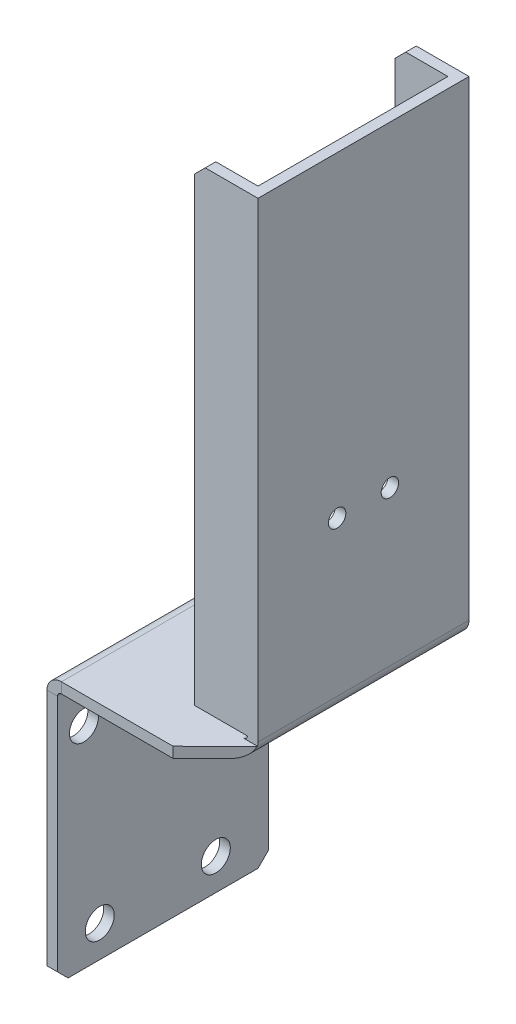
ISO-10303-21;
HEADER;
FILE_DESCRIPTION(('STEP AP214'),'2;1');
FILE_NAME('part.step','',(''),(''),'','','');
FILE_SCHEMA(('AUTOMOTIVE_DESIGN { 1 0 10303 214 1 1 1 1 }'));
ENDSEC;
DATA;
#1=APPLICATION_CONTEXT('core data for automotive mechanical design processes');
#2=APPLICATION_PROTOCOL_DEFINITION('international standard','automotive_design',2000,#1);
#3=PRODUCT_CONTEXT('',#1,'mechanical');
#4=PRODUCT('Part','Part','',(#3));
#5=PRODUCT_RELATED_PRODUCT_CATEGORY('part','',(#4));
#6=PRODUCT_DEFINITION_FORMATION('','',#4);
#7=PRODUCT_DEFINITION_CONTEXT('part definition',#1,'design');
#8=PRODUCT_DEFINITION('design','',#6,#7);
#9=PRODUCT_DEFINITION_SHAPE('','',#8);
#10=(LENGTH_UNIT() NAMED_UNIT(*) SI_UNIT(.MILLI.,.METRE.));
#11=(NAMED_UNIT(*) PLANE_ANGLE_UNIT() SI_UNIT($,.RADIAN.));
#12=(NAMED_UNIT(*) SI_UNIT($,.STERADIAN.) SOLID_ANGLE_UNIT());
#13=UNCERTAINTY_MEASURE_WITH_UNIT(LENGTH_MEASURE(1.E-05),#10,'distance_accuracy_value','');
#14=(GEOMETRIC_REPRESENTATION_CONTEXT(3) GLOBAL_UNCERTAINTY_ASSIGNED_CONTEXT((#13)) GLOBAL_UNIT_ASSIGNED_CONTEXT((#10,
#11,#12)) REPRESENTATION_CONTEXT('',''));
#15=CARTESIAN_POINT('',(0.,0.,0.));
#16=DIRECTION('',(0.,0.,1.));
#17=DIRECTION('',(1.,0.,0.));
#18=AXIS2_PLACEMENT_3D('',#15,#16,#17);
#19=CARTESIAN_POINT('',(30.,50.,24.));
#20=DIRECTION('',(-1.,0.,0.));
#21=DIRECTION('',(0.,0.,1.));
#22=AXIS2_PLACEMENT_3D('',#19,#20,#21);
#23=PLANE('',#22);
#24=CARTESIAN_POINT('',(30.,80.,0.999999999999992));
#25=DIRECTION('',(-1.,0.,0.));
#26=DIRECTION('',(0.,0.,1.));
#27=AXIS2_PLACEMENT_3D('',#24,#25,#26);
#28=CIRCLE('',#27,1.64999999999998);
#29=CARTESIAN_POINT('',(30.,80.,2.64999999999998));
#30=VERTEX_POINT('',#29);
#31=EDGE_CURVE('E455',#30,#30,#28,.T.);
#32=ORIENTED_EDGE('',*,*,#31,.F.);
#33=EDGE_LOOP('',(#32));
#34=FACE_BOUND('',#33,.T.);
#35=CARTESIAN_POINT('',(30.,80.,-9.00000000000001));
#36=DIRECTION('',(-1.,0.,0.));
#37=DIRECTION('',(0.,0.,1.));
#38=AXIS2_PLACEMENT_3D('',#35,#36,#37);
#39=CIRCLE('',#38,1.64999999999998);
#40=CARTESIAN_POINT('',(30.,80.,-7.35000000000002));
#41=VERTEX_POINT('',#40);
#42=EDGE_CURVE('E230',#41,#41,#39,.T.);
#43=ORIENTED_EDGE('',*,*,#42,.F.);
#44=EDGE_LOOP('',(#43));
#45=FACE_BOUND('',#44,.T.);
#46=DIRECTION('',(0.,0.,-1.));
#47=VECTOR('',#46,1.);
#48=CARTESIAN_POINT('',(30.,50.7366,24.));
#49=LINE('',#48,#47);
#50=CARTESIAN_POINT('',(30.,50.7366,14.));
#51=VERTEX_POINT('',#50);
#52=CARTESIAN_POINT('',(30.,50.7366,-22.));
#53=VERTEX_POINT('',#52);
#54=EDGE_CURVE('E364',#51,#53,#49,.T.);
#55=ORIENTED_EDGE('',*,*,#54,.F.);
#56=DIRECTION('',(0.,-1.,0.));
#57=VECTOR('',#56,1.);
#58=CARTESIAN_POINT('',(30.,140.,14.));
#59=LINE('',#58,#57);
#60=CARTESIAN_POINT('',(30.,140.,14.));
#61=VERTEX_POINT('',#60);
#62=EDGE_CURVE('E217',#61,#51,#59,.T.);
#63=ORIENTED_EDGE('',*,*,#62,.F.);
#64=DIRECTION('',(0.,0.,-1.));
#65=VECTOR('',#64,1.);
#66=CARTESIAN_POINT('',(30.,140.,24.));
#67=LINE('',#66,#65);
#68=CARTESIAN_POINT('',(30.,140.,-22.));
#69=VERTEX_POINT('',#68);
#70=EDGE_CURVE('E368',#61,#69,#67,.T.);
#71=ORIENTED_EDGE('',*,*,#70,.T.);
#72=DIRECTION('',(0.,1.,0.));
#73=VECTOR('',#72,1.);
#74=CARTESIAN_POINT('',(30.,140.,-22.));
#75=LINE('',#74,#73);
#76=EDGE_CURVE('E237',#53,#69,#75,.T.);
#77=ORIENTED_EDGE('',*,*,#76,.F.);
#78=EDGE_LOOP('',(#55,#63,#71,#77));
#79=FACE_BOUND('',#78,.T.);
#80=ADVANCED_FACE('F36',(#34,#45,#79),#23,.T.);
#81=CARTESIAN_POINT('',(2.7366,50.,24.));
#82=DIRECTION('',(0.,0.,1.));
#83=DIRECTION('',(1.,0.,0.));
#84=AXIS2_PLACEMENT_3D('',#81,#82,#83);
#85=PLANE('',#84);
#86=DIRECTION('',(0.,-1.,0.));
#87=VECTOR('',#86,1.);
#88=CARTESIAN_POINT('',(2.7366,50.,24.));
#89=LINE('',#88,#87);
#90=CARTESIAN_POINT('',(2.7366,50.,24.));
#91=VERTEX_POINT('',#90);
#92=CARTESIAN_POINT('',(2.7366,48.,24.));
#93=VERTEX_POINT('',#92);
#94=EDGE_CURVE('E383',#91,#93,#89,.T.);
#95=ORIENTED_EDGE('',*,*,#94,.F.);
#96=CARTESIAN_POINT('',(2.7366,47.2634,24.));
#97=DIRECTION('',(0.,0.,1.));
#98=DIRECTION('',(1.,0.,0.));
#99=AXIS2_PLACEMENT_3D('',#96,#97,#98);
#100=CIRCLE('',#99,2.7366);
#101=CARTESIAN_POINT('',(0.,47.2634,24.));
#102=VERTEX_POINT('',#101);
#103=EDGE_CURVE('E310',#102,#91,#100,.F.);
#104=ORIENTED_EDGE('',*,*,#103,.F.);
#105=DIRECTION('',(-1.,0.,0.));
#106=VECTOR('',#105,1.);
#107=CARTESIAN_POINT('',(2.,47.2634,24.));
#108=LINE('',#107,#106);
#109=CARTESIAN_POINT('',(2.,47.2634,24.));
#110=VERTEX_POINT('',#109);
#111=EDGE_CURVE('E380',#110,#102,#108,.T.);
#112=ORIENTED_EDGE('',*,*,#111,.F.);
#113=CARTESIAN_POINT('',(2.7366,47.2634,24.));
#114=DIRECTION('',(0.,0.,1.));
#115=DIRECTION('',(1.,0.,0.));
#116=AXIS2_PLACEMENT_3D('',#113,#114,#115);
#117=CIRCLE('',#116,0.7366);
#118=EDGE_CURVE('E318',#110,#93,#117,.F.);
#119=ORIENTED_EDGE('',*,*,#118,.T.);
#120=EDGE_LOOP('',(#95,#104,#112,#119));
#121=FACE_BOUND('',#120,.T.);
#122=ADVANCED_FACE('F517',(#121),#85,.T.);
#123=CARTESIAN_POINT('',(2.,47.2634,24.));
#124=DIRECTION('',(0.,0.,1.));
#125=DIRECTION('',(1.,0.,0.));
#126=AXIS2_PLACEMENT_3D('',#123,#124,#125);
#127=PLANE('',#126);
#128=DIRECTION('',(0.,1.,0.));
#129=VECTOR('',#128,1.);
#130=CARTESIAN_POINT('',(23.8983648911094,0.,24.));
#131=LINE('',#130,#129);
#132=CARTESIAN_POINT('',(23.8983648911094,48.,24.));
#133=VERTEX_POINT('',#132);
#134=CARTESIAN_POINT('',(23.8983648911094,50.,24.));
#135=VERTEX_POINT('',#134);
#136=EDGE_CURVE('E254',#133,#135,#131,.T.);
#137=ORIENTED_EDGE('',*,*,#136,.T.);
#138=DIRECTION('',(1.,0.,0.));
#139=VECTOR('',#138,1.);
#140=CARTESIAN_POINT('',(0.,50.,24.));
#141=LINE('',#140,#139);
#142=EDGE_CURVE('E307',#91,#135,#141,.T.);
#143=ORIENTED_EDGE('',*,*,#142,.F.);
#144=ORIENTED_EDGE('',*,*,#94,.T.);
#145=DIRECTION('',(1.,0.,0.));
#146=VECTOR('',#145,1.);
#147=CARTESIAN_POINT('',(0.,48.,24.));
#148=LINE('',#147,#146);
#149=EDGE_CURVE('E321',#93,#133,#148,.T.);
#150=ORIENTED_EDGE('',*,*,#149,.T.);
#151=EDGE_LOOP('',(#137,#143,#144,#150));
#152=FACE_BOUND('',#151,.T.);
#153=ADVANCED_FACE('F529',(#152),#127,.T.);
#154=CARTESIAN_POINT('',(29.2634,50.,-24.));
#155=DIRECTION('',(0.,0.,-1.));
#156=DIRECTION('',(-1.,0.,0.));
#157=AXIS2_PLACEMENT_3D('',#154,#155,#156);
#158=PLANE('',#157);
#159=DIRECTION('',(0.,-1.,0.));
#160=VECTOR('',#159,1.);
#161=CARTESIAN_POINT('',(29.2634,50.,-24.));
#162=LINE('',#161,#160);
#163=CARTESIAN_POINT('',(29.2634,50.,-24.));
#164=VERTEX_POINT('',#163);
#165=CARTESIAN_POINT('',(29.2634,48.,-24.));
#166=VERTEX_POINT('',#165);
#167=EDGE_CURVE('E377',#164,#166,#162,.T.);
#168=ORIENTED_EDGE('',*,*,#167,.F.);
#169=CARTESIAN_POINT('',(29.2634,50.7366,-24.));
#170=DIRECTION('',(0.,0.,-1.));
#171=DIRECTION('',(-1.,0.,0.));
#172=AXIS2_PLACEMENT_3D('',#169,#170,#171);
#173=CIRCLE('',#172,0.7366);
#174=CARTESIAN_POINT('',(30.,50.7366,-24.));
#175=VERTEX_POINT('',#174);
#176=EDGE_CURVE('E329',#164,#175,#173,.F.);
#177=ORIENTED_EDGE('',*,*,#176,.T.);
#178=DIRECTION('',(-1.,0.,0.));
#179=VECTOR('',#178,1.);
#180=CARTESIAN_POINT('',(32.,50.7366,-24.));
#181=LINE('',#180,#179);
#182=CARTESIAN_POINT('',(32.,50.7366,-24.));
#183=VERTEX_POINT('',#182);
#184=EDGE_CURVE('E374',#183,#175,#181,.T.);
#185=ORIENTED_EDGE('',*,*,#184,.F.);
#186=CARTESIAN_POINT('',(29.2634,50.7366,-24.));
#187=DIRECTION('',(0.,0.,1.));
#188=DIRECTION('',(1.,0.,0.));
#189=AXIS2_PLACEMENT_3D('',#186,#187,#188);
#190=CIRCLE('',#189,2.7366);
#191=EDGE_CURVE('E311',#166,#183,#190,.T.);
#192=ORIENTED_EDGE('',*,*,#191,.F.);
#193=EDGE_LOOP('',(#168,#177,#185,#192));
#194=FACE_BOUND('',#193,.T.);
#195=ADVANCED_FACE('F549',(#194),#158,.T.);
#196=CARTESIAN_POINT('',(32.,50.7366,-24.));
#197=DIRECTION('',(0.,0.,-1.));
#198=DIRECTION('',(-1.,0.,0.));
#199=AXIS2_PLACEMENT_3D('',#196,#197,#198);
#200=PLANE('',#199);
#201=DIRECTION('',(0.,1.,0.));
#202=VECTOR('',#201,1.);
#203=CARTESIAN_POINT('',(8.,0.,-24.));
#204=LINE('',#203,#202);
#205=CARTESIAN_POINT('',(8.,48.,-24.));
#206=VERTEX_POINT('',#205);
#207=CARTESIAN_POINT('',(8.,50.,-24.));
#208=VERTEX_POINT('',#207);
#209=EDGE_CURVE('E262',#206,#208,#204,.T.);
#210=ORIENTED_EDGE('',*,*,#209,.T.);
#211=DIRECTION('',(1.,0.,0.));
#212=VECTOR('',#211,1.);
#213=CARTESIAN_POINT('',(0.,50.,-24.));
#214=LINE('',#213,#212);
#215=EDGE_CURVE('E332',#208,#164,#214,.T.);
#216=ORIENTED_EDGE('',*,*,#215,.T.);
#217=ORIENTED_EDGE('',*,*,#167,.T.);
#218=DIRECTION('',(1.,0.,0.));
#219=VECTOR('',#218,1.);
#220=CARTESIAN_POINT('',(0.,48.,-24.));
#221=LINE('',#220,#219);
#222=EDGE_CURVE('E334',#206,#166,#221,.T.);
#223=ORIENTED_EDGE('',*,*,#222,.F.);
#224=EDGE_LOOP('',(#210,#216,#217,#223));
#225=FACE_BOUND('',#224,.T.);
#226=ADVANCED_FACE('F580',(#225),#200,.T.);
#227=CARTESIAN_POINT('',(32.,50.,24.));
#228=DIRECTION('',(-1.,0.,0.));
#229=DIRECTION('',(0.,0.,1.));
#230=AXIS2_PLACEMENT_3D('',#227,#228,#229);
#231=PLANE('',#230);
#232=CARTESIAN_POINT('',(32.,80.,0.999999999999992));
#233=DIRECTION('',(1.,0.,0.));
#234=DIRECTION('',(0.,0.,-1.));
#235=AXIS2_PLACEMENT_3D('',#232,#233,#234);
#236=CIRCLE('',#235,1.64999999999998);
#237=CARTESIAN_POINT('',(32.,80.,-0.649999999999993));
#238=VERTEX_POINT('',#237);
#239=EDGE_CURVE('E458',#238,#238,#236,.T.);
#240=ORIENTED_EDGE('',*,*,#239,.F.);
#241=EDGE_LOOP('',(#240));
#242=FACE_BOUND('',#241,.T.);
#243=CARTESIAN_POINT('',(32.,80.,-9.00000000000001));
#244=DIRECTION('',(1.,0.,0.));
#245=DIRECTION('',(0.,0.,-1.));
#246=AXIS2_PLACEMENT_3D('',#243,#244,#245);
#247=CIRCLE('',#246,1.64999999999998);
#248=CARTESIAN_POINT('',(32.,80.,-10.65));
#249=VERTEX_POINT('',#248);
#250=EDGE_CURVE('E452',#249,#249,#247,.T.);
#251=ORIENTED_EDGE('',*,*,#250,.F.);
#252=EDGE_LOOP('',(#251));
#253=FACE_BOUND('',#252,.T.);
#254=DIRECTION('',(0.,0.,-1.));
#255=VECTOR('',#254,1.);
#256=CARTESIAN_POINT('',(32.,140.,24.));
#257=LINE('',#256,#255);
#258=CARTESIAN_POINT('',(32.,140.,16.));
#259=VERTEX_POINT('',#258);
#260=CARTESIAN_POINT('',(32.,140.,-24.));
#261=VERTEX_POINT('',#260);
#262=EDGE_CURVE('E371',#259,#261,#257,.T.);
#263=ORIENTED_EDGE('',*,*,#262,.F.);
#264=DIRECTION('',(0.,-1.,0.));
#265=VECTOR('',#264,1.);
#266=CARTESIAN_POINT('',(32.,140.,16.));
#267=LINE('',#266,#265);
#268=CARTESIAN_POINT('',(32.,50.7366,16.));
#269=VERTEX_POINT('',#268);
#270=EDGE_CURVE('E283',#259,#269,#267,.T.);
#271=ORIENTED_EDGE('',*,*,#270,.T.);
#272=DIRECTION('',(0.,0.,-1.));
#273=VECTOR('',#272,1.);
#274=CARTESIAN_POINT('',(32.,50.7366,24.));
#275=LINE('',#274,#273);
#276=EDGE_CURVE('E324',#269,#183,#275,.T.);
#277=ORIENTED_EDGE('',*,*,#276,.T.);
#278=DIRECTION('',(0.,1.,0.));
#279=VECTOR('',#278,1.);
#280=CARTESIAN_POINT('',(32.,50.,-24.));
#281=LINE('',#280,#279);
#282=EDGE_CURVE('E304',#183,#261,#281,.T.);
#283=ORIENTED_EDGE('',*,*,#282,.T.);
#284=EDGE_LOOP('',(#263,#271,#277,#283));
#285=FACE_BOUND('',#284,.T.);
#286=ADVANCED_FACE('F544',(#242,#253,#285),#231,.F.);
#287=CARTESIAN_POINT('',(30.,140.,24.));
#288=DIRECTION('',(0.,1.,0.));
#289=DIRECTION('',(0.,0.,1.));
#290=AXIS2_PLACEMENT_3D('',#287,#288,#289);
#291=PLANE('',#290);
#292=DIRECTION('',(1.,0.,0.));
#293=VECTOR('',#292,1.);
#294=CARTESIAN_POINT('',(20.,140.,14.));
#295=LINE('',#294,#293);
#296=CARTESIAN_POINT('',(22.,140.,14.));
#297=VERTEX_POINT('',#296);
#298=EDGE_CURVE('E221',#297,#61,#295,.T.);
#299=ORIENTED_EDGE('',*,*,#298,.F.);
#300=DIRECTION('',(0.,0.,1.));
#301=VECTOR('',#300,1.);
#302=CARTESIAN_POINT('',(22.,140.,16.));
#303=LINE('',#302,#301);
#304=CARTESIAN_POINT('',(22.,140.,16.));
#305=VERTEX_POINT('',#304);
#306=EDGE_CURVE('E417',#297,#305,#303,.T.);
#307=ORIENTED_EDGE('',*,*,#306,.T.);
#308=DIRECTION('',(-1.,0.,0.));
#309=VECTOR('',#308,1.);
#310=CARTESIAN_POINT('',(32.,140.,16.));
#311=LINE('',#310,#309);
#312=EDGE_CURVE('E286',#259,#305,#311,.T.);
#313=ORIENTED_EDGE('',*,*,#312,.F.);
#314=ORIENTED_EDGE('',*,*,#262,.T.);
#315=DIRECTION('',(1.,0.,0.));
#316=VECTOR('',#315,1.);
#317=CARTESIAN_POINT('',(30.,140.,-24.));
#318=LINE('',#317,#316);
#319=CARTESIAN_POINT('',(22.,140.,-24.));
#320=VERTEX_POINT('',#319);
#321=EDGE_CURVE('E327',#320,#261,#318,.T.);
#322=ORIENTED_EDGE('',*,*,#321,.F.);
#323=DIRECTION('',(0.,0.,1.));
#324=VECTOR('',#323,1.);
#325=CARTESIAN_POINT('',(22.,140.,24.));
#326=LINE('',#325,#324);
#327=CARTESIAN_POINT('',(22.,140.,-22.));
#328=VERTEX_POINT('',#327);
#329=EDGE_CURVE('E415',#320,#328,#326,.T.);
#330=ORIENTED_EDGE('',*,*,#329,.T.);
#331=DIRECTION('',(1.,0.,0.));
#332=VECTOR('',#331,1.);
#333=CARTESIAN_POINT('',(20.,140.,-22.));
#334=LINE('',#333,#332);
#335=EDGE_CURVE('E241',#328,#69,#334,.T.);
#336=ORIENTED_EDGE('',*,*,#335,.T.);
#337=ORIENTED_EDGE('',*,*,#70,.F.);
#338=EDGE_LOOP('',(#299,#307,#313,#314,#322,#330,#336,#337));
#339=FACE_BOUND('',#338,.T.);
#340=ADVANCED_FACE('F431',(#339),#291,.T.);
#341=CARTESIAN_POINT('',(29.2634,50.7366,24.));
#342=DIRECTION('',(0.,0.,-1.));
#343=DIRECTION('',(-1.,0.,0.));
#344=AXIS2_PLACEMENT_3D('',#341,#342,#343);
#345=CYLINDRICAL_SURFACE('',#344,0.7366);
#346=CARTESIAN_POINT('',(29.2634,50.7366,16.));
#347=DIRECTION('',(0.,0.,-1.));
#348=DIRECTION('',(0.,1.,0.));
#349=AXIS2_PLACEMENT_3D('',#346,#347,#348);
#350=CIRCLE('',#349,0.7366);
#351=CARTESIAN_POINT('',(30.,50.7366,16.));
#352=VERTEX_POINT('',#351);
#353=CARTESIAN_POINT('',(29.2634,50.,16.));
#354=VERTEX_POINT('',#353);
#355=EDGE_CURVE('E290',#352,#354,#350,.T.);
#356=ORIENTED_EDGE('',*,*,#355,.F.);
#357=EDGE_CURVE('E365',#352,#51,#49,.T.);
#358=ORIENTED_EDGE('',*,*,#357,.T.);
#359=ORIENTED_EDGE('',*,*,#54,.T.);
#360=DIRECTION('',(0.,0.,1.));
#361=VECTOR('',#360,1.);
#362=CARTESIAN_POINT('',(30.,50.7366,-24.));
#363=LINE('',#362,#361);
#364=EDGE_CURVE('E233',#175,#53,#363,.T.);
#365=ORIENTED_EDGE('',*,*,#364,.F.);
#366=ORIENTED_EDGE('',*,*,#176,.F.);
#367=DIRECTION('',(0.,0.,-1.));
#368=VECTOR('',#367,1.);
#369=CARTESIAN_POINT('',(29.2634,50.,24.));
#370=LINE('',#369,#368);
#371=EDGE_CURVE('E361',#354,#164,#370,.T.);
#372=ORIENTED_EDGE('',*,*,#371,.F.);
#373=EDGE_LOOP('',(#356,#358,#359,#365,#366,#372));
#374=FACE_BOUND('',#373,.T.);
#375=ADVANCED_FACE('F553',(#374),#345,.F.);
#376=CARTESIAN_POINT('',(0.,50.,24.));
#377=DIRECTION('',(0.,1.,0.));
#378=DIRECTION('',(0.,0.,1.));
#379=AXIS2_PLACEMENT_3D('',#376,#377,#378);
#380=PLANE('',#379);
#381=CARTESIAN_POINT('',(16.,50.,0.));
#382=DIRECTION('',(0.,1.,0.));
#383=DIRECTION('',(0.,0.,1.));
#384=AXIS2_PLACEMENT_3D('',#381,#382,#383);
#385=CIRCLE('',#384,8.);
#386=CARTESIAN_POINT('',(16.,50.,8.));
#387=VERTEX_POINT('',#386);
#388=EDGE_CURVE('E461',#387,#387,#385,.T.);
#389=ORIENTED_EDGE('',*,*,#388,.F.);
#390=EDGE_LOOP('',(#389));
#391=FACE_BOUND('',#390,.T.);
#392=DIRECTION('',(-0.711555933956261,0.,0.702629456293737));
#393=VECTOR('',#392,1.);
#394=CARTESIAN_POINT('',(32.,50.,16.));
#395=LINE('',#394,#393);
#396=CARTESIAN_POINT('',(31.8990023979349,50.,16.0997305859449));
#397=VERTEX_POINT('',#396);
#398=EDGE_CURVE('E252',#397,#135,#395,.T.);
#399=ORIENTED_EDGE('',*,*,#398,.F.);
#400=DIRECTION('',(0.,0.,-1.));
#401=VECTOR('',#400,1.);
#402=CARTESIAN_POINT('',(31.8990023979349,50.,24.));
#403=LINE('',#402,#401);
#404=CARTESIAN_POINT('',(31.8990023979349,50.,16.));
#405=VERTEX_POINT('',#404);
#406=EDGE_CURVE('E388',#405,#397,#403,.F.);
#407=ORIENTED_EDGE('',*,*,#406,.F.);
#408=DIRECTION('',(-1.,0.,0.));
#409=VECTOR('',#408,1.);
#410=CARTESIAN_POINT('',(32.,50.,16.));
#411=LINE('',#410,#409);
#412=EDGE_CURVE('E287',#405,#354,#411,.T.);
#413=ORIENTED_EDGE('',*,*,#412,.T.);
#414=ORIENTED_EDGE('',*,*,#371,.T.);
#415=ORIENTED_EDGE('',*,*,#215,.F.);
#416=DIRECTION('',(0.707106781186548,0.,-0.707106781186548));
#417=VECTOR('',#416,1.);
#418=CARTESIAN_POINT('',(8.,50.,-24.));
#419=LINE('',#418,#417);
#420=CARTESIAN_POINT('',(2.7366,50.,-18.7366));
#421=VERTEX_POINT('',#420);
#422=EDGE_CURVE('E260',#421,#208,#419,.T.);
#423=ORIENTED_EDGE('',*,*,#422,.F.);
#424=DIRECTION('',(0.,0.,-1.));
#425=VECTOR('',#424,1.);
#426=CARTESIAN_POINT('',(2.7366,50.,24.));
#427=LINE('',#426,#425);
#428=EDGE_CURVE('E358',#91,#421,#427,.T.);
#429=ORIENTED_EDGE('',*,*,#428,.F.);
#430=ORIENTED_EDGE('',*,*,#142,.T.);
#431=EDGE_LOOP('',(#399,#407,#413,#414,#415,#423,#429,#430));
#432=FACE_BOUND('',#431,.T.);
#433=ADVANCED_FACE('F527',(#391,#432),#380,.T.);
#434=CARTESIAN_POINT('',(2.7366,47.2634,24.));
#435=DIRECTION('',(0.,0.,-1.));
#436=DIRECTION('',(-1.,0.,0.));
#437=AXIS2_PLACEMENT_3D('',#434,#435,#436);
#438=CYLINDRICAL_SURFACE('',#437,2.7366);
#439=CARTESIAN_POINT('',(2.7366,47.2634,-18.7366));
#440=DIRECTION('',(0.707106781186548,0.,0.707106781186548));
#441=DIRECTION('',(0.707106781186548,0.,-0.707106781186548));
#442=AXIS2_PLACEMENT_3D('',#439,#440,#441);
#443=ELLIPSE('',#442,3.87013683479021,2.7366);
#444=CARTESIAN_POINT('',(0.,47.2634,-16.));
#445=VERTEX_POINT('',#444);
#446=EDGE_CURVE('E271',#445,#421,#443,.F.);
#447=ORIENTED_EDGE('',*,*,#446,.F.);
#448=DIRECTION('',(0.,0.,-1.));
#449=VECTOR('',#448,1.);
#450=CARTESIAN_POINT('',(0.,47.2634,24.));
#451=LINE('',#450,#449);
#452=EDGE_CURVE('E355',#102,#445,#451,.T.);
#453=ORIENTED_EDGE('',*,*,#452,.F.);
#454=ORIENTED_EDGE('',*,*,#103,.T.);
#455=ORIENTED_EDGE('',*,*,#428,.T.);
#456=EDGE_LOOP('',(#447,#453,#454,#455));
#457=FACE_BOUND('',#456,.T.);
#458=ADVANCED_FACE('F514',(#457),#438,.T.);
#459=CARTESIAN_POINT('',(0.,0.,24.));
#460=DIRECTION('',(-1.,0.,0.));
#461=DIRECTION('',(0.,0.,1.));
#462=AXIS2_PLACEMENT_3D('',#459,#460,#461);
#463=PLANE('',#462);
#464=CARTESIAN_POINT('',(0.,40.,19.));
#465=DIRECTION('',(1.,0.,0.));
#466=DIRECTION('',(0.,0.,-1.));
#467=AXIS2_PLACEMENT_3D('',#464,#465,#466);
#468=CIRCLE('',#467,2.75);
#469=CARTESIAN_POINT('',(0.,40.,16.25));
#470=VERTEX_POINT('',#469);
#471=EDGE_CURVE('E464',#470,#470,#468,.T.);
#472=ORIENTED_EDGE('',*,*,#471,.T.);
#473=EDGE_LOOP('',(#472));
#474=FACE_BOUND('',#473,.T.);
#475=DIRECTION('',(0.,1.,0.));
#476=VECTOR('',#475,1.);
#477=CARTESIAN_POINT('',(0.,0.,-16.));
#478=LINE('',#477,#476);
#479=CARTESIAN_POINT('',(0.,2.00000000000002,-16.));
#480=VERTEX_POINT('',#479);
#481=EDGE_CURVE('E276',#480,#445,#478,.T.);
#482=ORIENTED_EDGE('',*,*,#481,.F.);
#483=DIRECTION('',(0.,-0.707106781186545,0.70710678118655));
#484=VECTOR('',#483,1.);
#485=CARTESIAN_POINT('',(0.,-19.,5.00000000000014));
#486=LINE('',#485,#484);
#487=CARTESIAN_POINT('',(0.,0.,-14.));
#488=VERTEX_POINT('',#487);
#489=EDGE_CURVE('E399',#480,#488,#486,.T.);
#490=ORIENTED_EDGE('',*,*,#489,.T.);
#491=DIRECTION('',(0.,0.,-1.));
#492=VECTOR('',#491,1.);
#493=CARTESIAN_POINT('',(0.,0.,24.));
#494=LINE('',#493,#492);
#495=CARTESIAN_POINT('',(0.,0.,22.));
#496=VERTEX_POINT('',#495);
#497=EDGE_CURVE('E352',#496,#488,#494,.T.);
#498=ORIENTED_EDGE('',*,*,#497,.F.);
#499=DIRECTION('',(0.,0.707106781186548,0.707106781186548));
#500=VECTOR('',#499,1.);
#501=CARTESIAN_POINT('',(0.,0.999999999999994,23.));
#502=LINE('',#501,#500);
#503=CARTESIAN_POINT('',(0.,1.99999999999999,24.));
#504=VERTEX_POINT('',#503);
#505=EDGE_CURVE('E397',#496,#504,#502,.T.);
#506=ORIENTED_EDGE('',*,*,#505,.T.);
#507=DIRECTION('',(0.,1.,0.));
#508=VECTOR('',#507,1.);
#509=CARTESIAN_POINT('',(0.,0.,24.));
#510=LINE('',#509,#508);
#511=EDGE_CURVE('E314',#504,#102,#510,.T.);
#512=ORIENTED_EDGE('',*,*,#511,.T.);
#513=ORIENTED_EDGE('',*,*,#452,.T.);
#514=EDGE_LOOP('',(#482,#490,#498,#506,#512,#513));
#515=FACE_BOUND('',#514,.T.);
#516=CARTESIAN_POINT('',(0.,6.,-6.));
#517=DIRECTION('',(1.,0.,0.));
#518=DIRECTION('',(0.,0.,1.));
#519=AXIS2_PLACEMENT_3D('',#516,#517,#518);
#520=CIRCLE('',#519,2.75);
#521=CARTESIAN_POINT('',(0.,6.,-3.25));
#522=VERTEX_POINT('',#521);
#523=EDGE_CURVE('E295',#522,#522,#520,.T.);
#524=ORIENTED_EDGE('',*,*,#523,.T.);
#525=EDGE_LOOP('',(#524));
#526=FACE_BOUND('',#525,.T.);
#527=CARTESIAN_POINT('',(0.,6.,16.));
#528=DIRECTION('',(1.,0.,0.));
#529=DIRECTION('',(0.,0.,-1.));
#530=AXIS2_PLACEMENT_3D('',#527,#528,#529);
#531=CIRCLE('',#530,2.75);
#532=CARTESIAN_POINT('',(0.,6.,13.25));
#533=VERTEX_POINT('',#532);
#534=EDGE_CURVE('E301',#533,#533,#531,.T.);
#535=ORIENTED_EDGE('',*,*,#534,.T.);
#536=EDGE_LOOP('',(#535));
#537=FACE_BOUND('',#536,.T.);
#538=ADVANCED_FACE('F471',(#474,#515,#526,#537),#463,.T.);
#539=CARTESIAN_POINT('',(2.,0.,24.));
#540=DIRECTION('',(0.,-1.,0.));
#541=DIRECTION('',(0.,0.,-1.));
#542=AXIS2_PLACEMENT_3D('',#539,#540,#541);
#543=PLANE('',#542);
#544=ORIENTED_EDGE('',*,*,#497,.T.);
#545=DIRECTION('',(1.,0.,0.));
#546=VECTOR('',#545,1.);
#547=CARTESIAN_POINT('',(2.,0.,-14.));
#548=LINE('',#547,#546);
#549=CARTESIAN_POINT('',(2.,0.,-14.));
#550=VERTEX_POINT('',#549);
#551=EDGE_CURVE('E404',#488,#550,#548,.T.);
#552=ORIENTED_EDGE('',*,*,#551,.T.);
#553=DIRECTION('',(0.,0.,-1.));
#554=VECTOR('',#553,1.);
#555=CARTESIAN_POINT('',(2.,0.,24.));
#556=LINE('',#555,#554);
#557=CARTESIAN_POINT('',(2.,0.,22.));
#558=VERTEX_POINT('',#557);
#559=EDGE_CURVE('E349',#558,#550,#556,.T.);
#560=ORIENTED_EDGE('',*,*,#559,.F.);
#561=DIRECTION('',(-1.,0.,0.));
#562=VECTOR('',#561,1.);
#563=CARTESIAN_POINT('',(0.,0.,22.));
#564=LINE('',#563,#562);
#565=EDGE_CURVE('E401',#558,#496,#564,.T.);
#566=ORIENTED_EDGE('',*,*,#565,.T.);
#567=EDGE_LOOP('',(#544,#552,#560,#566));
#568=FACE_BOUND('',#567,.T.);
#569=ADVANCED_FACE('F485',(#568),#543,.T.);
#570=CARTESIAN_POINT('',(2.,0.,24.));
#571=DIRECTION('',(-1.,0.,0.));
#572=DIRECTION('',(0.,0.,1.));
#573=AXIS2_PLACEMENT_3D('',#570,#571,#572);
#574=PLANE('',#573);
#575=CARTESIAN_POINT('',(2.,40.,19.));
#576=DIRECTION('',(1.,0.,0.));
#577=DIRECTION('',(0.,0.,-1.));
#578=AXIS2_PLACEMENT_3D('',#575,#576,#577);
#579=CIRCLE('',#578,2.75);
#580=CARTESIAN_POINT('',(2.,40.,16.25));
#581=VERTEX_POINT('',#580);
#582=EDGE_CURVE('E465',#581,#581,#579,.T.);
#583=ORIENTED_EDGE('',*,*,#582,.F.);
#584=EDGE_LOOP('',(#583));
#585=FACE_BOUND('',#584,.T.);
#586=CARTESIAN_POINT('',(2.,6.,-6.));
#587=DIRECTION('',(1.,0.,0.));
#588=DIRECTION('',(0.,0.,1.));
#589=AXIS2_PLACEMENT_3D('',#586,#587,#588);
#590=CIRCLE('',#589,2.75);
#591=CARTESIAN_POINT('',(2.,6.,-3.25));
#592=VERTEX_POINT('',#591);
#593=EDGE_CURVE('E294',#592,#592,#590,.T.);
#594=ORIENTED_EDGE('',*,*,#593,.F.);
#595=EDGE_LOOP('',(#594));
#596=FACE_BOUND('',#595,.T.);
#597=CARTESIAN_POINT('',(2.,6.,16.));
#598=DIRECTION('',(1.,0.,0.));
#599=DIRECTION('',(0.,0.,-1.));
#600=AXIS2_PLACEMENT_3D('',#597,#598,#599);
#601=CIRCLE('',#600,2.75);
#602=CARTESIAN_POINT('',(2.,6.,13.25));
#603=VERTEX_POINT('',#602);
#604=EDGE_CURVE('E298',#603,#603,#601,.T.);
#605=ORIENTED_EDGE('',*,*,#604,.F.);
#606=EDGE_LOOP('',(#605));
#607=FACE_BOUND('',#606,.T.);
#608=ORIENTED_EDGE('',*,*,#559,.T.);
#609=DIRECTION('',(0.,0.707106781186545,-0.70710678118655));
#610=VECTOR('',#609,1.);
#611=CARTESIAN_POINT('',(2.,2.,-16.));
#612=LINE('',#611,#610);
#613=CARTESIAN_POINT('',(2.,2.,-16.));
#614=VERTEX_POINT('',#613);
#615=EDGE_CURVE('E408',#550,#614,#612,.T.);
#616=ORIENTED_EDGE('',*,*,#615,.T.);
#617=DIRECTION('',(0.,1.,0.));
#618=VECTOR('',#617,1.);
#619=CARTESIAN_POINT('',(2.,0.,-16.));
#620=LINE('',#619,#618);
#621=CARTESIAN_POINT('',(2.,47.2634,-16.));
#622=VERTEX_POINT('',#621);
#623=EDGE_CURVE('E281',#614,#622,#620,.T.);
#624=ORIENTED_EDGE('',*,*,#623,.T.);
#625=DIRECTION('',(0.,0.,-1.));
#626=VECTOR('',#625,1.);
#627=CARTESIAN_POINT('',(2.,47.2634,24.));
#628=LINE('',#627,#626);
#629=EDGE_CURVE('E346',#110,#622,#628,.T.);
#630=ORIENTED_EDGE('',*,*,#629,.F.);
#631=DIRECTION('',(0.,1.,0.));
#632=VECTOR('',#631,1.);
#633=CARTESIAN_POINT('',(2.,0.,24.));
#634=LINE('',#633,#632);
#635=CARTESIAN_POINT('',(2.,1.99999999999999,24.));
#636=VERTEX_POINT('',#635);
#637=EDGE_CURVE('E316',#636,#110,#634,.T.);
#638=ORIENTED_EDGE('',*,*,#637,.F.);
#639=DIRECTION('',(0.,-0.707106781186548,-0.707106781186548));
#640=VECTOR('',#639,1.);
#641=CARTESIAN_POINT('',(2.,0.,22.));
#642=LINE('',#641,#640);
#643=EDGE_CURVE('E406',#636,#558,#642,.T.);
#644=ORIENTED_EDGE('',*,*,#643,.T.);
#645=EDGE_LOOP('',(#608,#616,#624,#630,#638,#644));
#646=FACE_BOUND('',#645,.T.);
#647=ADVANCED_FACE('F481',(#585,#596,#607,#646),#574,.F.);
#648=CARTESIAN_POINT('',(2.7366,47.2634,24.));
#649=DIRECTION('',(0.,0.,-1.));
#650=DIRECTION('',(-1.,0.,0.));
#651=AXIS2_PLACEMENT_3D('',#648,#649,#650);
#652=CYLINDRICAL_SURFACE('',#651,0.7366);
#653=CARTESIAN_POINT('',(1.99999999999999,47.2634,-18.));
#654=VERTEX_POINT('',#653);
#655=EDGE_CURVE('E345',#622,#654,#628,.T.);
#656=ORIENTED_EDGE('',*,*,#655,.T.);
#657=CARTESIAN_POINT('',(2.7366,47.2634,-18.7366));
#658=DIRECTION('',(0.707106781186548,0.,0.707106781186548));
#659=DIRECTION('',(0.707106781186548,0.,-0.707106781186548));
#660=AXIS2_PLACEMENT_3D('',#657,#658,#659);
#661=ELLIPSE('',#660,1.04170971004402,0.7366);
#662=CARTESIAN_POINT('',(2.7366,48.,-18.7366));
#663=VERTEX_POINT('',#662);
#664=EDGE_CURVE('E268',#654,#663,#661,.F.);
#665=ORIENTED_EDGE('',*,*,#664,.T.);
#666=DIRECTION('',(0.,0.,-1.));
#667=VECTOR('',#666,1.);
#668=CARTESIAN_POINT('',(2.7366,48.,24.));
#669=LINE('',#668,#667);
#670=EDGE_CURVE('E342',#93,#663,#669,.T.);
#671=ORIENTED_EDGE('',*,*,#670,.F.);
#672=ORIENTED_EDGE('',*,*,#118,.F.);
#673=ORIENTED_EDGE('',*,*,#629,.T.);
#674=EDGE_LOOP('',(#656,#665,#671,#672,#673));
#675=FACE_BOUND('',#674,.T.);
#676=ADVANCED_FACE('F484',(#675),#652,.F.);
#677=CARTESIAN_POINT('',(0.,48.,24.));
#678=DIRECTION('',(0.,1.,0.));
#679=DIRECTION('',(0.,0.,1.));
#680=AXIS2_PLACEMENT_3D('',#677,#678,#679);
#681=PLANE('',#680);
#682=CARTESIAN_POINT('',(16.,48.,0.));
#683=DIRECTION('',(0.,1.,0.));
#684=DIRECTION('',(0.,0.,1.));
#685=AXIS2_PLACEMENT_3D('',#682,#683,#684);
#686=CIRCLE('',#685,8.);
#687=CARTESIAN_POINT('',(16.,48.,8.));
#688=VERTEX_POINT('',#687);
#689=EDGE_CURVE('E40',#688,#688,#686,.T.);
#690=ORIENTED_EDGE('',*,*,#689,.T.);
#691=EDGE_LOOP('',(#690));
#692=FACE_BOUND('',#691,.T.);
#693=DIRECTION('',(0.,0.,-1.));
#694=VECTOR('',#693,1.);
#695=CARTESIAN_POINT('',(29.2634,48.,24.));
#696=LINE('',#695,#694);
#697=CARTESIAN_POINT('',(29.2634,48.,18.7022693204209));
#698=VERTEX_POINT('',#697);
#699=EDGE_CURVE('E340',#698,#166,#696,.T.);
#700=ORIENTED_EDGE('',*,*,#699,.F.);
#701=DIRECTION('',(-0.711555933956261,0.,0.702629456293737));
#702=VECTOR('',#701,1.);
#703=CARTESIAN_POINT('',(11.7983396192661,48.,35.9482303107577));
#704=LINE('',#703,#702);
#705=EDGE_CURVE('E257',#698,#133,#704,.T.);
#706=ORIENTED_EDGE('',*,*,#705,.T.);
#707=ORIENTED_EDGE('',*,*,#149,.F.);
#708=ORIENTED_EDGE('',*,*,#670,.T.);
#709=DIRECTION('',(0.707106781186548,0.,-0.707106781186548));
#710=VECTOR('',#709,1.);
#711=CARTESIAN_POINT('',(-20.,48.,4.));
#712=LINE('',#711,#710);
#713=EDGE_CURVE('E273',#663,#206,#712,.T.);
#714=ORIENTED_EDGE('',*,*,#713,.T.);
#715=ORIENTED_EDGE('',*,*,#222,.T.);
#716=EDGE_LOOP('',(#700,#706,#707,#708,#714,#715));
#717=FACE_BOUND('',#716,.T.);
#718=ADVANCED_FACE('F535',(#692,#717),#681,.F.);
#719=CARTESIAN_POINT('',(29.2634,50.7366,24.));
#720=DIRECTION('',(0.,0.,-1.));
#721=DIRECTION('',(-1.,0.,0.));
#722=AXIS2_PLACEMENT_3D('',#719,#720,#721);
#723=CYLINDRICAL_SURFACE('',#722,2.7366);
#724=ORIENTED_EDGE('',*,*,#406,.T.);
#725=CARTESIAN_POINT('',(29.2634,50.7366,18.7022693204209));
#726=DIRECTION('',(-0.702629456293737,0.,-0.711555933956261));
#727=DIRECTION('',(0.711555933956261,0.,-0.702629456293737));
#728=AXIS2_PLACEMENT_3D('',#725,#726,#727);
#729=ELLIPSE('',#728,3.84593799223129,2.7366);
#730=EDGE_CURVE('E391',#397,#698,#729,.T.);
#731=ORIENTED_EDGE('',*,*,#730,.T.);
#732=ORIENTED_EDGE('',*,*,#699,.T.);
#733=ORIENTED_EDGE('',*,*,#191,.T.);
#734=ORIENTED_EDGE('',*,*,#276,.F.);
#735=CARTESIAN_POINT('',(29.2634,50.7366,16.));
#736=DIRECTION('',(0.,0.,-1.));
#737=DIRECTION('',(0.,1.,0.));
#738=AXIS2_PLACEMENT_3D('',#735,#736,#737);
#739=CIRCLE('',#738,2.7366);
#740=EDGE_CURVE('E385',#269,#405,#739,.T.);
#741=ORIENTED_EDGE('',*,*,#740,.T.);
#742=EDGE_LOOP('',(#724,#731,#732,#733,#734,#741));
#743=FACE_BOUND('',#742,.T.);
#744=ADVANCED_FACE('F538',(#743),#723,.T.);
#745=CARTESIAN_POINT('',(29.2634,50.7366,24.));
#746=DIRECTION('',(0.,0.,-1.));
#747=DIRECTION('',(-1.,0.,0.));
#748=AXIS2_PLACEMENT_3D('',#745,#746,#747);
#749=PLANE('',#748);
#750=ORIENTED_EDGE('',*,*,#511,.F.);
#751=DIRECTION('',(1.,0.,0.));
#752=VECTOR('',#751,1.);
#753=CARTESIAN_POINT('',(2.,1.99999999999999,24.));
#754=LINE('',#753,#752);
#755=EDGE_CURVE('E410',#504,#636,#754,.T.);
#756=ORIENTED_EDGE('',*,*,#755,.T.);
#757=ORIENTED_EDGE('',*,*,#637,.T.);
#758=ORIENTED_EDGE('',*,*,#111,.T.);
#759=EDGE_LOOP('',(#750,#756,#757,#758));
#760=FACE_BOUND('',#759,.T.);
#761=ADVANCED_FACE('F762',(#760),#749,.F.);
#762=CARTESIAN_POINT('',(29.2634,50.7366,-24.));
#763=DIRECTION('',(0.,0.,-1.));
#764=DIRECTION('',(-1.,0.,0.));
#765=AXIS2_PLACEMENT_3D('',#762,#763,#764);
#766=PLANE('',#765);
#767=DIRECTION('',(0.,-1.,0.));
#768=VECTOR('',#767,1.);
#769=CARTESIAN_POINT('',(20.,140.,-24.));
#770=LINE('',#769,#768);
#771=CARTESIAN_POINT('',(20.,138.,-24.));
#772=VERTEX_POINT('',#771);
#773=CARTESIAN_POINT('',(20.,50.7366,-24.));
#774=VERTEX_POINT('',#773);
#775=EDGE_CURVE('E234',#772,#774,#770,.T.);
#776=ORIENTED_EDGE('',*,*,#775,.F.);
#777=DIRECTION('',(-0.707106781186548,-0.707106781186548,0.));
#778=VECTOR('',#777,1.);
#779=CARTESIAN_POINT('',(-19.,99.,-24.));
#780=LINE('',#779,#778);
#781=EDGE_CURVE('E45',#772,#320,#780,.F.);
#782=ORIENTED_EDGE('',*,*,#781,.T.);
#783=ORIENTED_EDGE('',*,*,#321,.T.);
#784=ORIENTED_EDGE('',*,*,#282,.F.);
#785=ORIENTED_EDGE('',*,*,#184,.T.);
#786=DIRECTION('',(1.,0.,0.));
#787=VECTOR('',#786,1.);
#788=CARTESIAN_POINT('',(20.,50.7366,-24.));
#789=LINE('',#788,#787);
#790=EDGE_CURVE('E250',#774,#175,#789,.T.);
#791=ORIENTED_EDGE('',*,*,#790,.F.);
#792=EDGE_LOOP('',(#776,#782,#783,#784,#785,#791));
#793=FACE_BOUND('',#792,.T.);
#794=ADVANCED_FACE('F426',(#793),#766,.T.);
#795=CARTESIAN_POINT('',(0.,6.,16.));
#796=DIRECTION('',(1.,0.,0.));
#797=DIRECTION('',(0.,0.,-1.));
#798=AXIS2_PLACEMENT_3D('',#795,#796,#797);
#799=CYLINDRICAL_SURFACE('',#798,2.75);
#800=ORIENTED_EDGE('',*,*,#534,.F.);
#801=EDGE_LOOP('',(#800));
#802=FACE_BOUND('',#801,.T.);
#803=ORIENTED_EDGE('',*,*,#604,.T.);
#804=EDGE_LOOP('',(#803));
#805=FACE_BOUND('',#804,.T.);
#806=ADVANCED_FACE('F849',(#802,#805),#799,.F.);
#807=CARTESIAN_POINT('',(0.,6.,-6.));
#808=DIRECTION('',(1.,0.,0.));
#809=DIRECTION('',(0.,0.,-1.));
#810=AXIS2_PLACEMENT_3D('',#807,#808,#809);
#811=CYLINDRICAL_SURFACE('',#810,2.75);
#812=ORIENTED_EDGE('',*,*,#523,.F.);
#813=EDGE_LOOP('',(#812));
#814=FACE_BOUND('',#813,.T.);
#815=ORIENTED_EDGE('',*,*,#593,.T.);
#816=EDGE_LOOP('',(#815));
#817=FACE_BOUND('',#816,.T.);
#818=ADVANCED_FACE('F842',(#814,#817),#811,.F.);
#819=CARTESIAN_POINT('',(32.,140.,16.));
#820=DIRECTION('',(0.,0.,-1.));
#821=DIRECTION('',(0.,1.,0.));
#822=AXIS2_PLACEMENT_3D('',#819,#820,#821);
#823=PLANE('',#822);
#824=ORIENTED_EDGE('',*,*,#312,.T.);
#825=DIRECTION('',(-0.707106781186548,-0.707106781186548,0.));
#826=VECTOR('',#825,1.);
#827=CARTESIAN_POINT('',(20.,138.,16.));
#828=LINE('',#827,#826);
#829=CARTESIAN_POINT('',(20.,138.,16.));
#830=VERTEX_POINT('',#829);
#831=EDGE_CURVE('E419',#305,#830,#828,.T.);
#832=ORIENTED_EDGE('',*,*,#831,.T.);
#833=DIRECTION('',(0.,1.,0.));
#834=VECTOR('',#833,1.);
#835=CARTESIAN_POINT('',(20.,140.,16.));
#836=LINE('',#835,#834);
#837=CARTESIAN_POINT('',(20.,50.7366,16.));
#838=VERTEX_POINT('',#837);
#839=EDGE_CURVE('E211',#838,#830,#836,.T.);
#840=ORIENTED_EDGE('',*,*,#839,.F.);
#841=DIRECTION('',(1.,0.,0.));
#842=VECTOR('',#841,1.);
#843=CARTESIAN_POINT('',(20.,50.7366,16.));
#844=LINE('',#843,#842);
#845=EDGE_CURVE('E222',#838,#352,#844,.T.);
#846=ORIENTED_EDGE('',*,*,#845,.T.);
#847=ORIENTED_EDGE('',*,*,#355,.T.);
#848=ORIENTED_EDGE('',*,*,#412,.F.);
#849=ORIENTED_EDGE('',*,*,#740,.F.);
#850=ORIENTED_EDGE('',*,*,#270,.F.);
#851=EDGE_LOOP('',(#824,#832,#840,#846,#847,#848,#849,#850));
#852=FACE_BOUND('',#851,.T.);
#853=ADVANCED_FACE('F448',(#852),#823,.F.);
#854=CARTESIAN_POINT('',(32.,47.2634,-24.));
#855=DIRECTION('',(0.,1.,0.));
#856=DIRECTION('',(0.,0.,1.));
#857=AXIS2_PLACEMENT_3D('',#854,#855,#856);
#858=PLANE('',#857);
#859=DIRECTION('',(-1.,0.,0.));
#860=VECTOR('',#859,1.);
#861=CARTESIAN_POINT('',(32.,47.2634,-16.));
#862=LINE('',#861,#860);
#863=EDGE_CURVE('E278',#622,#445,#862,.T.);
#864=ORIENTED_EDGE('',*,*,#863,.T.);
#865=DIRECTION('',(0.707106781186548,0.,-0.707106781186548));
#866=VECTOR('',#865,1.);
#867=CARTESIAN_POINT('',(20.,47.2634,-36.));
#868=LINE('',#867,#866);
#869=EDGE_CURVE('E265',#445,#654,#868,.T.);
#870=ORIENTED_EDGE('',*,*,#869,.T.);
#871=ORIENTED_EDGE('',*,*,#655,.F.);
#872=EDGE_LOOP('',(#864,#870,#871));
#873=FACE_BOUND('',#872,.T.);
#874=ADVANCED_FACE('F770',(#873),#858,.F.);
#875=CARTESIAN_POINT('',(32.,0.,-16.));
#876=DIRECTION('',(0.,0.,1.));
#877=DIRECTION('',(1.,0.,0.));
#878=AXIS2_PLACEMENT_3D('',#875,#876,#877);
#879=PLANE('',#878);
#880=ORIENTED_EDGE('',*,*,#623,.F.);
#881=DIRECTION('',(-1.,0.,0.));
#882=VECTOR('',#881,1.);
#883=CARTESIAN_POINT('',(0.,2.,-16.));
#884=LINE('',#883,#882);
#885=EDGE_CURVE('E394',#614,#480,#884,.T.);
#886=ORIENTED_EDGE('',*,*,#885,.T.);
#887=ORIENTED_EDGE('',*,*,#481,.T.);
#888=ORIENTED_EDGE('',*,*,#863,.F.);
#889=EDGE_LOOP('',(#880,#886,#887,#888));
#890=FACE_BOUND('',#889,.T.);
#891=ADVANCED_FACE('F504',(#890),#879,.F.);
#892=CARTESIAN_POINT('',(8.,0.,-24.));
#893=DIRECTION('',(0.707106781186548,0.,0.707106781186548));
#894=DIRECTION('',(0.707106781186548,0.,-0.707106781186548));
#895=AXIS2_PLACEMENT_3D('',#892,#893,#894);
#896=PLANE('',#895);
#897=ORIENTED_EDGE('',*,*,#664,.F.);
#898=ORIENTED_EDGE('',*,*,#869,.F.);
#899=ORIENTED_EDGE('',*,*,#446,.T.);
#900=ORIENTED_EDGE('',*,*,#422,.T.);
#901=ORIENTED_EDGE('',*,*,#209,.F.);
#902=ORIENTED_EDGE('',*,*,#713,.F.);
#903=EDGE_LOOP('',(#897,#898,#899,#900,#901,#902));
#904=FACE_BOUND('',#903,.T.);
#905=ADVANCED_FACE('F562',(#904),#896,.F.);
#906=CARTESIAN_POINT('',(32.,0.,16.));
#907=DIRECTION('',(-0.702629456293737,0.,-0.711555933956261));
#908=DIRECTION('',(-0.711555933956261,0.,0.702629456293737));
#909=AXIS2_PLACEMENT_3D('',#906,#907,#908);
#910=PLANE('',#909);
#911=ORIENTED_EDGE('',*,*,#730,.F.);
#912=ORIENTED_EDGE('',*,*,#398,.T.);
#913=ORIENTED_EDGE('',*,*,#136,.F.);
#914=ORIENTED_EDGE('',*,*,#705,.F.);
#915=EDGE_LOOP('',(#911,#912,#913,#914));
#916=FACE_BOUND('',#915,.T.);
#917=ADVANCED_FACE('F532',(#916),#910,.F.);
#918=CARTESIAN_POINT('',(20.,50.7366,-24.));
#919=DIRECTION('',(0.,1.,0.));
#920=DIRECTION('',(0.,0.,1.));
#921=AXIS2_PLACEMENT_3D('',#918,#919,#920);
#922=PLANE('',#921);
#923=ORIENTED_EDGE('',*,*,#364,.T.);
#924=DIRECTION('',(1.,0.,0.));
#925=VECTOR('',#924,1.);
#926=CARTESIAN_POINT('',(20.,50.7366,-22.));
#927=LINE('',#926,#925);
#928=CARTESIAN_POINT('',(20.,50.7366,-22.));
#929=VERTEX_POINT('',#928);
#930=EDGE_CURVE('E247',#929,#53,#927,.T.);
#931=ORIENTED_EDGE('',*,*,#930,.F.);
#932=DIRECTION('',(0.,0.,1.));
#933=VECTOR('',#932,1.);
#934=CARTESIAN_POINT('',(20.,50.7366,-24.));
#935=LINE('',#934,#933);
#936=EDGE_CURVE('E236',#774,#929,#935,.T.);
#937=ORIENTED_EDGE('',*,*,#936,.F.);
#938=ORIENTED_EDGE('',*,*,#790,.T.);
#939=EDGE_LOOP('',(#923,#931,#937,#938));
#940=FACE_BOUND('',#939,.T.);
#941=ADVANCED_FACE('F554',(#940),#922,.F.);
#942=CARTESIAN_POINT('',(20.,140.,-22.));
#943=DIRECTION('',(0.,0.,-1.));
#944=DIRECTION('',(0.,1.,0.));
#945=AXIS2_PLACEMENT_3D('',#942,#943,#944);
#946=PLANE('',#945);
#947=ORIENTED_EDGE('',*,*,#335,.F.);
#948=DIRECTION('',(0.707106781186548,0.707106781186548,0.));
#949=VECTOR('',#948,1.);
#950=CARTESIAN_POINT('',(20.,138.,-22.));
#951=LINE('',#950,#949);
#952=CARTESIAN_POINT('',(20.,138.,-22.));
#953=VERTEX_POINT('',#952);
#954=EDGE_CURVE('E11',#328,#953,#951,.F.);
#955=ORIENTED_EDGE('',*,*,#954,.T.);
#956=DIRECTION('',(0.,1.,0.));
#957=VECTOR('',#956,1.);
#958=CARTESIAN_POINT('',(20.,140.,-22.));
#959=LINE('',#958,#957);
#960=EDGE_CURVE('E239',#929,#953,#959,.T.);
#961=ORIENTED_EDGE('',*,*,#960,.F.);
#962=ORIENTED_EDGE('',*,*,#930,.T.);
#963=ORIENTED_EDGE('',*,*,#76,.T.);
#964=EDGE_LOOP('',(#947,#955,#961,#962,#963));
#965=FACE_BOUND('',#964,.T.);
#966=ADVANCED_FACE('F438',(#965),#946,.F.);
#967=CARTESIAN_POINT('',(20.,50.7366,-24.));
#968=DIRECTION('',(-1.,0.,0.));
#969=DIRECTION('',(0.,0.,1.));
#970=AXIS2_PLACEMENT_3D('',#967,#968,#969);
#971=PLANE('',#970);
#972=ORIENTED_EDGE('',*,*,#960,.T.);
#973=DIRECTION('',(0.,0.,-1.));
#974=VECTOR('',#973,1.);
#975=CARTESIAN_POINT('',(20.,138.,-24.));
#976=LINE('',#975,#974);
#977=EDGE_CURVE('E421',#953,#772,#976,.T.);
#978=ORIENTED_EDGE('',*,*,#977,.T.);
#979=ORIENTED_EDGE('',*,*,#775,.T.);
#980=ORIENTED_EDGE('',*,*,#936,.T.);
#981=EDGE_LOOP('',(#972,#978,#979,#980));
#982=FACE_BOUND('',#981,.T.);
#983=ADVANCED_FACE('F435',(#982),#971,.T.);
#984=CARTESIAN_POINT('',(20.,140.,14.));
#985=DIRECTION('',(0.,0.,1.));
#986=DIRECTION('',(0.,-1.,0.));
#987=AXIS2_PLACEMENT_3D('',#984,#985,#986);
#988=PLANE('',#987);
#989=DIRECTION('',(0.,-1.,0.));
#990=VECTOR('',#989,1.);
#991=CARTESIAN_POINT('',(20.,140.,14.));
#992=LINE('',#991,#990);
#993=CARTESIAN_POINT('',(20.,138.,14.));
#994=VERTEX_POINT('',#993);
#995=CARTESIAN_POINT('',(20.,50.7366,14.));
#996=VERTEX_POINT('',#995);
#997=EDGE_CURVE('E201',#994,#996,#992,.T.);
#998=ORIENTED_EDGE('',*,*,#997,.F.);
#999=DIRECTION('',(0.707106781186548,0.707106781186548,0.));
#1000=VECTOR('',#999,1.);
#1001=CARTESIAN_POINT('',(20.,138.,14.));
#1002=LINE('',#1001,#1000);
#1003=EDGE_CURVE('E413',#994,#297,#1002,.T.);
#1004=ORIENTED_EDGE('',*,*,#1003,.T.);
#1005=ORIENTED_EDGE('',*,*,#298,.T.);
#1006=ORIENTED_EDGE('',*,*,#62,.T.);
#1007=DIRECTION('',(1.,0.,0.));
#1008=VECTOR('',#1007,1.);
#1009=CARTESIAN_POINT('',(20.,50.7366,14.));
#1010=LINE('',#1009,#1008);
#1011=EDGE_CURVE('E214',#996,#51,#1010,.T.);
#1012=ORIENTED_EDGE('',*,*,#1011,.F.);
#1013=EDGE_LOOP('',(#998,#1004,#1005,#1006,#1012));
#1014=FACE_BOUND('',#1013,.T.);
#1015=ADVANCED_FACE('F215',(#1014),#988,.F.);
#1016=CARTESIAN_POINT('',(20.,50.7366,16.));
#1017=DIRECTION('',(0.,1.,0.));
#1018=DIRECTION('',(0.,0.,1.));
#1019=AXIS2_PLACEMENT_3D('',#1016,#1017,#1018);
#1020=PLANE('',#1019);
#1021=ORIENTED_EDGE('',*,*,#357,.F.);
#1022=ORIENTED_EDGE('',*,*,#845,.F.);
#1023=DIRECTION('',(0.,0.,1.));
#1024=VECTOR('',#1023,1.);
#1025=CARTESIAN_POINT('',(20.,50.7366,16.));
#1026=LINE('',#1025,#1024);
#1027=EDGE_CURVE('E206',#996,#838,#1026,.T.);
#1028=ORIENTED_EDGE('',*,*,#1027,.F.);
#1029=ORIENTED_EDGE('',*,*,#1011,.T.);
#1030=EDGE_LOOP('',(#1021,#1022,#1028,#1029));
#1031=FACE_BOUND('',#1030,.T.);
#1032=ADVANCED_FACE('F224',(#1031),#1020,.F.);
#1033=CARTESIAN_POINT('',(20.,50.7366,16.));
#1034=DIRECTION('',(1.,0.,0.));
#1035=DIRECTION('',(0.,0.,-1.));
#1036=AXIS2_PLACEMENT_3D('',#1033,#1034,#1035);
#1037=PLANE('',#1036);
#1038=ORIENTED_EDGE('',*,*,#839,.T.);
#1039=DIRECTION('',(0.,0.,-1.));
#1040=VECTOR('',#1039,1.);
#1041=CARTESIAN_POINT('',(20.,138.,14.));
#1042=LINE('',#1041,#1040);
#1043=EDGE_CURVE('E209',#830,#994,#1042,.T.);
#1044=ORIENTED_EDGE('',*,*,#1043,.T.);
#1045=ORIENTED_EDGE('',*,*,#997,.T.);
#1046=ORIENTED_EDGE('',*,*,#1027,.T.);
#1047=EDGE_LOOP('',(#1038,#1044,#1045,#1046));
#1048=FACE_BOUND('',#1047,.T.);
#1049=ADVANCED_FACE('F204',(#1048),#1037,.F.);
#1050=CARTESIAN_POINT('',(32.,2.,-16.));
#1051=DIRECTION('',(0.,-0.70710678118655,-0.707106781186545));
#1052=DIRECTION('',(0.,0.707106781186545,-0.70710678118655));
#1053=AXIS2_PLACEMENT_3D('',#1050,#1051,#1052);
#1054=PLANE('',#1053);
#1055=ORIENTED_EDGE('',*,*,#615,.F.);
#1056=ORIENTED_EDGE('',*,*,#551,.F.);
#1057=ORIENTED_EDGE('',*,*,#489,.F.);
#1058=ORIENTED_EDGE('',*,*,#885,.F.);
#1059=EDGE_LOOP('',(#1055,#1056,#1057,#1058));
#1060=FACE_BOUND('',#1059,.T.);
#1061=ADVANCED_FACE('F501',(#1060),#1054,.T.);
#1062=CARTESIAN_POINT('',(2.,0.,22.));
#1063=DIRECTION('',(0.,-0.707106781186547,0.707106781186547));
#1064=DIRECTION('',(0.,-0.707106781186548,-0.707106781186548));
#1065=AXIS2_PLACEMENT_3D('',#1062,#1063,#1064);
#1066=PLANE('',#1065);
#1067=ORIENTED_EDGE('',*,*,#643,.F.);
#1068=ORIENTED_EDGE('',*,*,#755,.F.);
#1069=ORIENTED_EDGE('',*,*,#505,.F.);
#1070=ORIENTED_EDGE('',*,*,#565,.F.);
#1071=EDGE_LOOP('',(#1067,#1068,#1069,#1070));
#1072=FACE_BOUND('',#1071,.T.);
#1073=ADVANCED_FACE('F591',(#1072),#1066,.T.);
#1074=CARTESIAN_POINT('',(20.,138.,16.));
#1075=DIRECTION('',(-0.707106781186547,0.707106781186547,0.));
#1076=DIRECTION('',(-0.707106781186548,-0.707106781186548,0.));
#1077=AXIS2_PLACEMENT_3D('',#1074,#1075,#1076);
#1078=PLANE('',#1077);
#1079=ORIENTED_EDGE('',*,*,#831,.F.);
#1080=ORIENTED_EDGE('',*,*,#306,.F.);
#1081=ORIENTED_EDGE('',*,*,#1003,.F.);
#1082=ORIENTED_EDGE('',*,*,#1043,.F.);
#1083=EDGE_LOOP('',(#1079,#1080,#1081,#1082));
#1084=FACE_BOUND('',#1083,.T.);
#1085=ADVANCED_FACE('F446',(#1084),#1078,.T.);
#1086=CARTESIAN_POINT('',(20.,138.,-24.));
#1087=DIRECTION('',(0.707106781186547,-0.707106781186547,0.));
#1088=DIRECTION('',(0.707106781186548,0.707106781186548,0.));
#1089=AXIS2_PLACEMENT_3D('',#1086,#1087,#1088);
#1090=PLANE('',#1089);
#1091=ORIENTED_EDGE('',*,*,#954,.F.);
#1092=ORIENTED_EDGE('',*,*,#329,.F.);
#1093=ORIENTED_EDGE('',*,*,#781,.F.);
#1094=ORIENTED_EDGE('',*,*,#977,.F.);
#1095=EDGE_LOOP('',(#1091,#1092,#1093,#1094));
#1096=FACE_BOUND('',#1095,.T.);
#1097=ADVANCED_FACE('F38',(#1096),#1090,.F.);
#1098=CARTESIAN_POINT('',(32.,80.,-9.00000000000001));
#1099=DIRECTION('',(1.,0.,0.));
#1100=DIRECTION('',(0.,0.,-1.));
#1101=AXIS2_PLACEMENT_3D('',#1098,#1099,#1100);
#1102=CYLINDRICAL_SURFACE('',#1101,1.64999999999998);
#1103=ORIENTED_EDGE('',*,*,#42,.T.);
#1104=EDGE_LOOP('',(#1103));
#1105=FACE_BOUND('',#1104,.T.);
#1106=ORIENTED_EDGE('',*,*,#250,.T.);
#1107=EDGE_LOOP('',(#1106));
#1108=FACE_BOUND('',#1107,.T.);
#1109=ADVANCED_FACE('F598',(#1105,#1108),#1102,.F.);
#1110=CARTESIAN_POINT('',(32.,80.,0.999999999999992));
#1111=DIRECTION('',(1.,0.,0.));
#1112=DIRECTION('',(0.,0.,-1.));
#1113=AXIS2_PLACEMENT_3D('',#1110,#1111,#1112);
#1114=CYLINDRICAL_SURFACE('',#1113,1.64999999999998);
#1115=ORIENTED_EDGE('',*,*,#31,.T.);
#1116=EDGE_LOOP('',(#1115));
#1117=FACE_BOUND('',#1116,.T.);
#1118=ORIENTED_EDGE('',*,*,#239,.T.);
#1119=EDGE_LOOP('',(#1118));
#1120=FACE_BOUND('',#1119,.T.);
#1121=ADVANCED_FACE('F602',(#1117,#1120),#1114,.F.);
#1122=CARTESIAN_POINT('',(16.,0.,0.));
#1123=DIRECTION('',(0.,1.,0.));
#1124=DIRECTION('',(0.,0.,1.));
#1125=AXIS2_PLACEMENT_3D('',#1122,#1123,#1124);
#1126=CYLINDRICAL_SURFACE('',#1125,8.);
#1127=ORIENTED_EDGE('',*,*,#388,.T.);
#1128=EDGE_LOOP('',(#1127));
#1129=FACE_BOUND('',#1128,.T.);
#1130=ORIENTED_EDGE('',*,*,#689,.F.);
#1131=EDGE_LOOP('',(#1130));
#1132=FACE_BOUND('',#1131,.T.);
#1133=ADVANCED_FACE('F477',(#1129,#1132),#1126,.F.);
#1134=CARTESIAN_POINT('',(0.,40.,19.));
#1135=DIRECTION('',(1.,0.,0.));
#1136=DIRECTION('',(0.,0.,-1.));
#1137=AXIS2_PLACEMENT_3D('',#1134,#1135,#1136);
#1138=CYLINDRICAL_SURFACE('',#1137,2.75);
#1139=ORIENTED_EDGE('',*,*,#471,.F.);
#1140=EDGE_LOOP('',(#1139));
#1141=FACE_BOUND('',#1140,.T.);
#1142=ORIENTED_EDGE('',*,*,#582,.T.);
#1143=EDGE_LOOP('',(#1142));
#1144=FACE_BOUND('',#1143,.T.);
#1145=ADVANCED_FACE('F474',(#1141,#1144),#1138,.F.);
#1146=CLOSED_SHELL('',(#80,#122,#153,#195,#226,#286,#340,#375,#433,#458,#538,#569,#647,#676,
#718,#744,#761,#794,#806,#818,#853,#874,#891,#905,#917,#941,#966,#983,#1015,#1032,#1049,#1061,
#1073,#1085,#1097,#1109,#1121,#1133,#1145));
#1147=MANIFOLD_SOLID_BREP('B2',#1146);
#1148=ADVANCED_BREP_SHAPE_REPRESENTATION('',(#18,#1147),#14);
#1149=SHAPE_DEFINITION_REPRESENTATION(#9,#1148);
ENDSEC;
END-ISO-10303-21;
